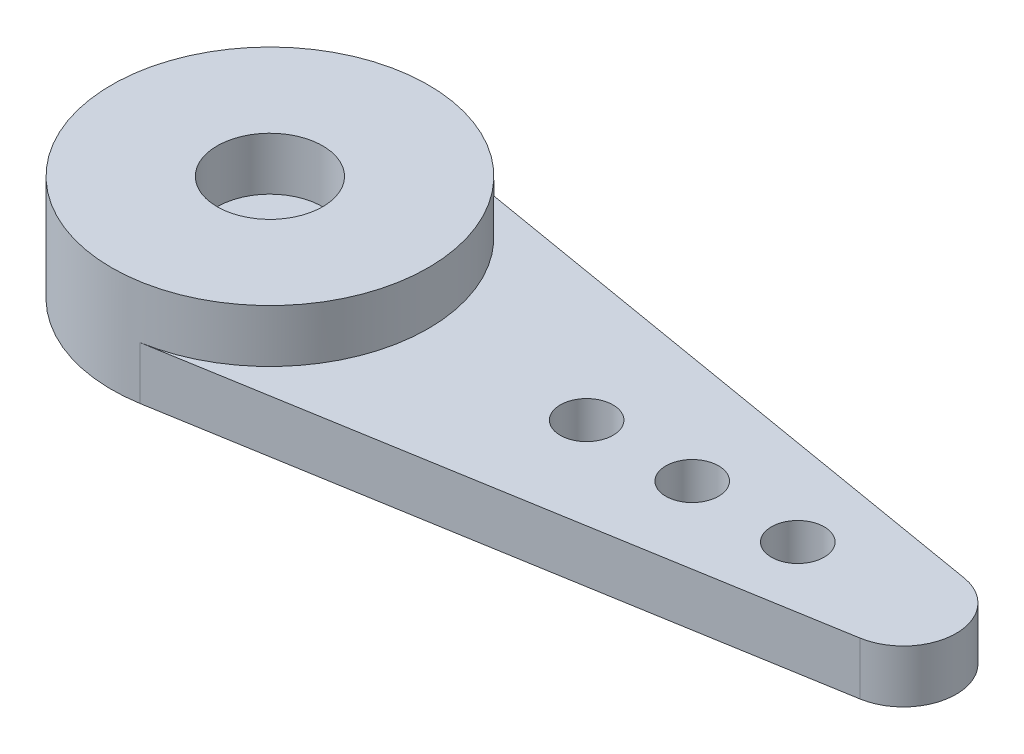
ISO-10303-21;
HEADER;
FILE_DESCRIPTION(('STEP AP214'),'2;1');
FILE_NAME('part.step','',(''),(''),'','','');
FILE_SCHEMA(('AUTOMOTIVE_DESIGN { 1 0 10303 214 1 1 1 1 }'));
ENDSEC;
DATA;
#1=APPLICATION_CONTEXT('core data for automotive mechanical design processes');
#2=APPLICATION_PROTOCOL_DEFINITION('international standard','automotive_design',2000,#1);
#3=PRODUCT_CONTEXT('',#1,'mechanical');
#4=PRODUCT('Part','Part','',(#3));
#5=PRODUCT_RELATED_PRODUCT_CATEGORY('part','',(#4));
#6=PRODUCT_DEFINITION_FORMATION('','',#4);
#7=PRODUCT_DEFINITION_CONTEXT('part definition',#1,'design');
#8=PRODUCT_DEFINITION('design','',#6,#7);
#9=PRODUCT_DEFINITION_SHAPE('','',#8);
#10=(LENGTH_UNIT() NAMED_UNIT(*) SI_UNIT(.MILLI.,.METRE.));
#11=(NAMED_UNIT(*) PLANE_ANGLE_UNIT() SI_UNIT($,.RADIAN.));
#12=(NAMED_UNIT(*) SI_UNIT($,.STERADIAN.) SOLID_ANGLE_UNIT());
#13=UNCERTAINTY_MEASURE_WITH_UNIT(LENGTH_MEASURE(1.E-05),#10,'distance_accuracy_value','');
#14=(GEOMETRIC_REPRESENTATION_CONTEXT(3) GLOBAL_UNCERTAINTY_ASSIGNED_CONTEXT((#13)) GLOBAL_UNIT_ASSIGNED_CONTEXT((#10,
#11,#12)) REPRESENTATION_CONTEXT('',''));
#15=CARTESIAN_POINT('',(0.,0.,0.));
#16=DIRECTION('',(0.,0.,1.));
#17=DIRECTION('',(1.,0.,0.));
#18=AXIS2_PLACEMENT_3D('',#15,#16,#17);
#19=CARTESIAN_POINT('',(5.18832532868772,4.57675164945443,0.));
#20=DIRECTION('',(0.,-1.,0.));
#21=DIRECTION('',(0.,0.,-1.));
#22=AXIS2_PLACEMENT_3D('',#19,#20,#21);
#23=CYLINDRICAL_SURFACE('',#22,9.00000000000001);
#24=CARTESIAN_POINT('',(5.18832532868772,1.57675164945443,0.));
#25=DIRECTION('',(0.,1.,0.));
#26=DIRECTION('',(0.,0.,1.));
#27=AXIS2_PLACEMENT_3D('',#24,#25,#26);
#28=CIRCLE('',#27,9.00000000000001);
#29=CARTESIAN_POINT('',(6.68832532868772,1.57675164945443,-8.87411967464943));
#30=VERTEX_POINT('',#29);
#31=CARTESIAN_POINT('',(6.68832532868772,1.57675164945443,8.87411967464943));
#32=VERTEX_POINT('',#31);
#33=EDGE_CURVE('E92',#30,#32,#28,.T.);
#34=ORIENTED_EDGE('',*,*,#33,.T.);
#35=DIRECTION('',(0.,-1.,0.));
#36=VECTOR('',#35,1.);
#37=CARTESIAN_POINT('',(6.68832532868772,4.57675164945443,8.87411967464943));
#38=LINE('',#37,#36);
#39=CARTESIAN_POINT('',(6.68832532868772,4.57675164945443,8.87411967464942));
#40=VERTEX_POINT('',#39);
#41=EDGE_CURVE('E11',#40,#32,#38,.T.);
#42=ORIENTED_EDGE('',*,*,#41,.F.);
#43=CARTESIAN_POINT('',(5.18832532868772,4.57675164945443,0.));
#44=DIRECTION('',(0.,1.,0.));
#45=DIRECTION('',(0.,0.,1.));
#46=AXIS2_PLACEMENT_3D('',#43,#44,#45);
#47=CIRCLE('',#46,9.);
#48=CARTESIAN_POINT('',(6.68832532868772,4.57675164945443,-8.87411967464943));
#49=VERTEX_POINT('',#48);
#50=EDGE_CURVE('E90',#40,#49,#47,.T.);
#51=ORIENTED_EDGE('',*,*,#50,.T.);
#52=DIRECTION('',(0.,-1.,0.));
#53=VECTOR('',#52,1.);
#54=CARTESIAN_POINT('',(6.68832532868772,4.57675164945443,-8.87411967464943));
#55=LINE('',#54,#53);
#56=EDGE_CURVE('E117',#49,#30,#55,.T.);
#57=ORIENTED_EDGE('',*,*,#56,.T.);
#58=EDGE_LOOP('',(#34,#42,#51,#57));
#59=FACE_BOUND('',#58,.T.);
#60=CARTESIAN_POINT('',(5.18832532868772,7.57675164945443,0.));
#61=DIRECTION('',(0.,1.,0.));
#62=DIRECTION('',(0.,0.,1.));
#63=AXIS2_PLACEMENT_3D('',#60,#61,#62);
#64=CIRCLE('',#63,9.);
#65=CARTESIAN_POINT('',(5.18832532868772,7.57675164945443,9.));
#66=VERTEX_POINT('',#65);
#67=EDGE_CURVE('E101',#66,#66,#64,.T.);
#68=ORIENTED_EDGE('',*,*,#67,.F.);
#69=EDGE_LOOP('',(#68));
#70=FACE_BOUND('',#69,.T.);
#71=ADVANCED_FACE('F38',(#59,#70),#23,.T.);
#72=CARTESIAN_POINT('',(6.68832532868772,4.57675164945443,8.87411967464943));
#73=DIRECTION('',(-0.166666666666667,0.,-0.986013297183269));
#74=DIRECTION('',(-0.986013297183269,0.,0.166666666666667));
#75=AXIS2_PLACEMENT_3D('',#72,#73,#74);
#76=PLANE('',#75);
#77=DIRECTION('',(0.986013297183269,0.,-0.166666666666667));
#78=VECTOR('',#77,1.);
#79=CARTESIAN_POINT('',(6.68832532868772,1.57675164945443,8.87411967464943));
#80=LINE('',#79,#78);
#81=CARTESIAN_POINT('',(41.6883253286877,1.57675164945443,2.95803989154981));
#82=VERTEX_POINT('',#81);
#83=EDGE_CURVE('E120',#32,#82,#80,.T.);
#84=ORIENTED_EDGE('',*,*,#83,.T.);
#85=DIRECTION('',(0.,-1.,0.));
#86=VECTOR('',#85,1.);
#87=CARTESIAN_POINT('',(41.6883253286877,4.57675164945443,2.95803989154981));
#88=LINE('',#87,#86);
#89=CARTESIAN_POINT('',(41.6883253286877,4.57675164945443,2.95803989154981));
#90=VERTEX_POINT('',#89);
#91=EDGE_CURVE('E47',#90,#82,#88,.T.);
#92=ORIENTED_EDGE('',*,*,#91,.F.);
#93=DIRECTION('',(0.986013297183269,0.,-0.166666666666667));
#94=VECTOR('',#93,1.);
#95=CARTESIAN_POINT('',(6.68832532868772,4.57675164945443,8.87411967464943));
#96=LINE('',#95,#94);
#97=EDGE_CURVE('E82',#40,#90,#96,.T.);
#98=ORIENTED_EDGE('',*,*,#97,.F.);
#99=ORIENTED_EDGE('',*,*,#41,.T.);
#100=EDGE_LOOP('',(#84,#92,#98,#99));
#101=FACE_BOUND('',#100,.T.);
#102=ADVANCED_FACE('F94',(#101),#76,.F.);
#103=CARTESIAN_POINT('',(41.1883253286877,4.57675164945443,0.));
#104=DIRECTION('',(0.,-1.,0.));
#105=DIRECTION('',(0.,0.,-1.));
#106=AXIS2_PLACEMENT_3D('',#103,#104,#105);
#107=CYLINDRICAL_SURFACE('',#106,3.);
#108=CARTESIAN_POINT('',(41.1883253286877,1.57675164945443,0.));
#109=DIRECTION('',(0.,1.,0.));
#110=DIRECTION('',(0.,0.,1.));
#111=AXIS2_PLACEMENT_3D('',#108,#109,#110);
#112=CIRCLE('',#111,3.);
#113=CARTESIAN_POINT('',(41.6883253286877,1.57675164945443,-2.95803989154981));
#114=VERTEX_POINT('',#113);
#115=EDGE_CURVE('E73',#82,#114,#112,.T.);
#116=ORIENTED_EDGE('',*,*,#115,.T.);
#117=DIRECTION('',(0.,-1.,0.));
#118=VECTOR('',#117,1.);
#119=CARTESIAN_POINT('',(41.6883253286877,4.57675164945443,-2.95803989154981));
#120=LINE('',#119,#118);
#121=CARTESIAN_POINT('',(41.6883253286877,4.57675164945443,-2.95803989154981));
#122=VERTEX_POINT('',#121);
#123=EDGE_CURVE('E129',#122,#114,#120,.T.);
#124=ORIENTED_EDGE('',*,*,#123,.F.);
#125=CARTESIAN_POINT('',(41.1883253286877,4.57675164945443,0.));
#126=DIRECTION('',(0.,1.,0.));
#127=DIRECTION('',(0.,0.,1.));
#128=AXIS2_PLACEMENT_3D('',#125,#126,#127);
#129=CIRCLE('',#128,3.);
#130=EDGE_CURVE('E97',#90,#122,#129,.T.);
#131=ORIENTED_EDGE('',*,*,#130,.F.);
#132=ORIENTED_EDGE('',*,*,#91,.T.);
#133=EDGE_LOOP('',(#116,#124,#131,#132));
#134=FACE_BOUND('',#133,.T.);
#135=ADVANCED_FACE('F132',(#134),#107,.T.);
#136=CARTESIAN_POINT('',(6.68832532868772,4.57675164945443,-8.87411967464943));
#137=DIRECTION('',(-0.166666666666667,0.,0.986013297183269));
#138=DIRECTION('',(0.986013297183269,0.,0.166666666666667));
#139=AXIS2_PLACEMENT_3D('',#136,#137,#138);
#140=PLANE('',#139);
#141=DIRECTION('',(-0.986013297183269,0.,-0.166666666666667));
#142=VECTOR('',#141,1.);
#143=CARTESIAN_POINT('',(6.68832532868772,1.57675164945443,-8.87411967464943));
#144=LINE('',#143,#142);
#145=EDGE_CURVE('E78',#114,#30,#144,.T.);
#146=ORIENTED_EDGE('',*,*,#145,.T.);
#147=ORIENTED_EDGE('',*,*,#56,.F.);
#148=DIRECTION('',(-0.986013297183269,0.,-0.166666666666667));
#149=VECTOR('',#148,1.);
#150=CARTESIAN_POINT('',(6.68832532868772,4.57675164945443,-8.87411967464943));
#151=LINE('',#150,#149);
#152=EDGE_CURVE('E55',#122,#49,#151,.T.);
#153=ORIENTED_EDGE('',*,*,#152,.F.);
#154=ORIENTED_EDGE('',*,*,#123,.T.);
#155=EDGE_LOOP('',(#146,#147,#153,#154));
#156=FACE_BOUND('',#155,.T.);
#157=ADVANCED_FACE('F146',(#156),#140,.F.);
#158=CARTESIAN_POINT('',(5.18832532868772,4.57675164945443,0.));
#159=DIRECTION('',(0.,1.,0.));
#160=DIRECTION('',(0.,0.,1.));
#161=AXIS2_PLACEMENT_3D('',#158,#159,#160);
#162=PLANE('',#161);
#163=CARTESIAN_POINT('',(29.1883253286877,4.57675164945443,0.));
#164=DIRECTION('',(0.,1.,0.));
#165=DIRECTION('',(0.,0.,1.));
#166=AXIS2_PLACEMENT_3D('',#163,#164,#165);
#167=CIRCLE('',#166,1.5);
#168=CARTESIAN_POINT('',(29.1883253286877,4.57675164945443,1.50000000000004));
#169=VERTEX_POINT('',#168);
#170=EDGE_CURVE('E238',#169,#169,#167,.T.);
#171=ORIENTED_EDGE('',*,*,#170,.F.);
#172=EDGE_LOOP('',(#171));
#173=FACE_BOUND('',#172,.T.);
#174=CARTESIAN_POINT('',(23.1883253286877,4.57675164945443,0.));
#175=DIRECTION('',(0.,1.,0.));
#176=DIRECTION('',(0.,0.,1.));
#177=AXIS2_PLACEMENT_3D('',#174,#175,#176);
#178=CIRCLE('',#177,1.5);
#179=CARTESIAN_POINT('',(23.1883253286877,4.57675164945443,1.50000000000009));
#180=VERTEX_POINT('',#179);
#181=EDGE_CURVE('E247',#180,#180,#178,.T.);
#182=ORIENTED_EDGE('',*,*,#181,.F.);
#183=EDGE_LOOP('',(#182));
#184=FACE_BOUND('',#183,.T.);
#185=CARTESIAN_POINT('',(35.1883253286877,4.57675164945443,0.));
#186=DIRECTION('',(0.,1.,0.));
#187=DIRECTION('',(0.,0.,1.));
#188=AXIS2_PLACEMENT_3D('',#185,#186,#187);
#189=CIRCLE('',#188,1.5);
#190=CARTESIAN_POINT('',(35.1883253286877,4.57675164945443,1.5));
#191=VERTEX_POINT('',#190);
#192=EDGE_CURVE('E244',#191,#191,#189,.T.);
#193=ORIENTED_EDGE('',*,*,#192,.F.);
#194=EDGE_LOOP('',(#193));
#195=FACE_BOUND('',#194,.T.);
#196=ORIENTED_EDGE('',*,*,#50,.F.);
#197=ORIENTED_EDGE('',*,*,#97,.T.);
#198=ORIENTED_EDGE('',*,*,#130,.T.);
#199=ORIENTED_EDGE('',*,*,#152,.T.);
#200=EDGE_LOOP('',(#196,#197,#198,#199));
#201=FACE_BOUND('',#200,.T.);
#202=ADVANCED_FACE('F99',(#173,#184,#195,#201),#162,.T.);
#203=CARTESIAN_POINT('',(5.18832532868772,1.57675164945443,0.));
#204=DIRECTION('',(0.,1.,0.));
#205=DIRECTION('',(0.,0.,1.));
#206=AXIS2_PLACEMENT_3D('',#203,#204,#205);
#207=PLANE('',#206);
#208=CARTESIAN_POINT('',(29.1883253286877,1.57675164945443,0.));
#209=DIRECTION('',(0.,1.,0.));
#210=DIRECTION('',(0.,0.,1.));
#211=AXIS2_PLACEMENT_3D('',#208,#209,#210);
#212=CIRCLE('',#211,1.5);
#213=CARTESIAN_POINT('',(29.1883253286877,1.57675164945443,1.50000000000004));
#214=VERTEX_POINT('',#213);
#215=EDGE_CURVE('E235',#214,#214,#212,.T.);
#216=ORIENTED_EDGE('',*,*,#215,.T.);
#217=EDGE_LOOP('',(#216));
#218=FACE_BOUND('',#217,.T.);
#219=CARTESIAN_POINT('',(23.1883253286877,1.57675164945443,0.));
#220=DIRECTION('',(0.,1.,0.));
#221=DIRECTION('',(0.,0.,1.));
#222=AXIS2_PLACEMENT_3D('',#219,#220,#221);
#223=CIRCLE('',#222,1.5);
#224=CARTESIAN_POINT('',(23.1883253286877,1.57675164945443,1.50000000000009));
#225=VERTEX_POINT('',#224);
#226=EDGE_CURVE('E240',#225,#225,#223,.T.);
#227=ORIENTED_EDGE('',*,*,#226,.T.);
#228=EDGE_LOOP('',(#227));
#229=FACE_BOUND('',#228,.T.);
#230=CARTESIAN_POINT('',(35.1883253286877,1.57675164945443,0.));
#231=DIRECTION('',(0.,1.,0.));
#232=DIRECTION('',(0.,0.,1.));
#233=AXIS2_PLACEMENT_3D('',#230,#231,#232);
#234=CIRCLE('',#233,1.5);
#235=CARTESIAN_POINT('',(35.1883253286877,1.57675164945443,1.5));
#236=VERTEX_POINT('',#235);
#237=EDGE_CURVE('E253',#236,#236,#234,.T.);
#238=ORIENTED_EDGE('',*,*,#237,.T.);
#239=EDGE_LOOP('',(#238));
#240=FACE_BOUND('',#239,.T.);
#241=ORIENTED_EDGE('',*,*,#33,.F.);
#242=ORIENTED_EDGE('',*,*,#145,.F.);
#243=ORIENTED_EDGE('',*,*,#115,.F.);
#244=ORIENTED_EDGE('',*,*,#83,.F.);
#245=EDGE_LOOP('',(#241,#242,#243,#244));
#246=FACE_BOUND('',#245,.T.);
#247=ADVANCED_FACE('F134',(#218,#229,#240,#246),#207,.F.);
#248=CARTESIAN_POINT('',(5.18832532868772,7.57675164945443,0.));
#249=DIRECTION('',(0.,1.,0.));
#250=DIRECTION('',(0.,0.,1.));
#251=AXIS2_PLACEMENT_3D('',#248,#249,#250);
#252=PLANE('',#251);
#253=CARTESIAN_POINT('',(5.18832532868772,7.57675164945443,0.));
#254=DIRECTION('',(0.,1.,0.));
#255=DIRECTION('',(0.,0.,1.));
#256=AXIS2_PLACEMENT_3D('',#253,#254,#255);
#257=CIRCLE('',#256,3.);
#258=CARTESIAN_POINT('',(5.18832532868772,7.57675164945443,3.));
#259=VERTEX_POINT('',#258);
#260=EDGE_CURVE('E109',#259,#259,#257,.T.);
#261=ORIENTED_EDGE('',*,*,#260,.F.);
#262=EDGE_LOOP('',(#261));
#263=FACE_BOUND('',#262,.T.);
#264=ORIENTED_EDGE('',*,*,#67,.T.);
#265=EDGE_LOOP('',(#264));
#266=FACE_BOUND('',#265,.T.);
#267=ADVANCED_FACE('F136',(#263,#266),#252,.T.);
#268=CARTESIAN_POINT('',(5.18832532868772,4.57675164945443,0.));
#269=DIRECTION('',(0.,1.,0.));
#270=DIRECTION('',(0.,0.,1.));
#271=AXIS2_PLACEMENT_3D('',#268,#269,#270);
#272=CYLINDRICAL_SURFACE('',#271,3.);
#273=CARTESIAN_POINT('',(5.18832532868772,4.57675164945443,0.));
#274=DIRECTION('',(0.,1.,0.));
#275=DIRECTION('',(0.,0.,1.));
#276=AXIS2_PLACEMENT_3D('',#273,#274,#275);
#277=CIRCLE('',#276,3.);
#278=CARTESIAN_POINT('',(5.18832532868772,4.57675164945443,3.));
#279=VERTEX_POINT('',#278);
#280=EDGE_CURVE('E102',#279,#279,#277,.T.);
#281=ORIENTED_EDGE('',*,*,#280,.F.);
#282=EDGE_LOOP('',(#281));
#283=FACE_BOUND('',#282,.T.);
#284=ORIENTED_EDGE('',*,*,#260,.T.);
#285=EDGE_LOOP('',(#284));
#286=FACE_BOUND('',#285,.T.);
#287=ADVANCED_FACE('F143',(#283,#286),#272,.F.);
#288=CARTESIAN_POINT('',(5.18832532868772,4.57675164945443,0.));
#289=DIRECTION('',(0.,1.,0.));
#290=DIRECTION('',(0.,0.,1.));
#291=AXIS2_PLACEMENT_3D('',#288,#289,#290);
#292=PLANE('',#291);
#293=ORIENTED_EDGE('',*,*,#280,.T.);
#294=EDGE_LOOP('',(#293));
#295=FACE_BOUND('',#294,.T.);
#296=ADVANCED_FACE('F189',(#295),#292,.T.);
#297=CARTESIAN_POINT('',(35.1883253286877,1.57675164945443,0.));
#298=DIRECTION('',(0.,1.,0.));
#299=DIRECTION('',(0.,0.,1.));
#300=AXIS2_PLACEMENT_3D('',#297,#298,#299);
#301=CYLINDRICAL_SURFACE('',#300,1.5);
#302=ORIENTED_EDGE('',*,*,#237,.F.);
#303=EDGE_LOOP('',(#302));
#304=FACE_BOUND('',#303,.T.);
#305=ORIENTED_EDGE('',*,*,#192,.T.);
#306=EDGE_LOOP('',(#305));
#307=FACE_BOUND('',#306,.T.);
#308=ADVANCED_FACE('F199',(#304,#307),#301,.F.);
#309=CARTESIAN_POINT('',(23.1883253286877,1.57675164945443,0.));
#310=DIRECTION('',(0.,1.,0.));
#311=DIRECTION('',(0.,0.,1.));
#312=AXIS2_PLACEMENT_3D('',#309,#310,#311);
#313=CYLINDRICAL_SURFACE('',#312,1.5);
#314=ORIENTED_EDGE('',*,*,#226,.F.);
#315=EDGE_LOOP('',(#314));
#316=FACE_BOUND('',#315,.T.);
#317=ORIENTED_EDGE('',*,*,#181,.T.);
#318=EDGE_LOOP('',(#317));
#319=FACE_BOUND('',#318,.T.);
#320=ADVANCED_FACE('F209',(#316,#319),#313,.F.);
#321=CARTESIAN_POINT('',(29.1883253286877,1.57675164945443,0.));
#322=DIRECTION('',(0.,1.,0.));
#323=DIRECTION('',(0.,0.,1.));
#324=AXIS2_PLACEMENT_3D('',#321,#322,#323);
#325=CYLINDRICAL_SURFACE('',#324,1.5);
#326=ORIENTED_EDGE('',*,*,#215,.F.);
#327=EDGE_LOOP('',(#326));
#328=FACE_BOUND('',#327,.T.);
#329=ORIENTED_EDGE('',*,*,#170,.T.);
#330=EDGE_LOOP('',(#329));
#331=FACE_BOUND('',#330,.T.);
#332=ADVANCED_FACE('F219',(#328,#331),#325,.F.);
#333=CLOSED_SHELL('',(#71,#102,#135,#157,#202,#247,#267,#287,#296,#308,#320,#332));
#334=MANIFOLD_SOLID_BREP('B2',#333);
#335=ADVANCED_BREP_SHAPE_REPRESENTATION('',(#18,#334),#14);
#336=SHAPE_DEFINITION_REPRESENTATION(#9,#335);
ENDSEC;
END-ISO-10303-21;
